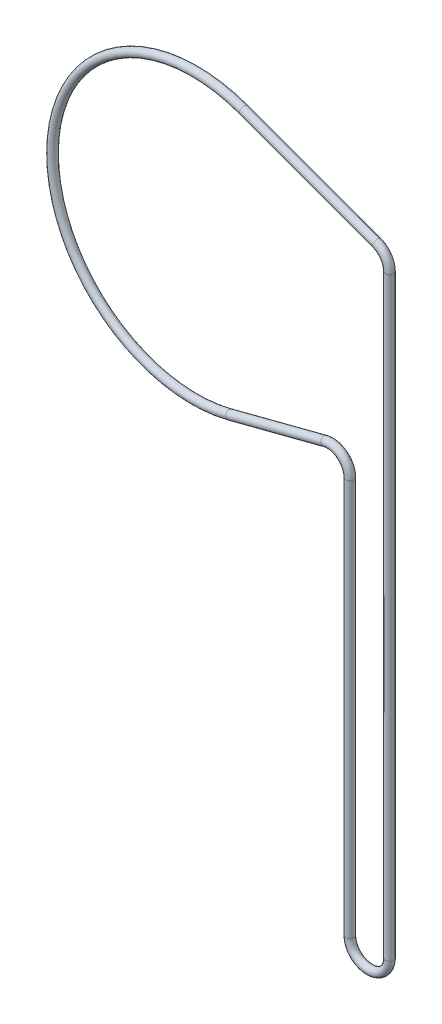
ISO-10303-21;
HEADER;
FILE_DESCRIPTION(('STEP AP214'),'2;1');
FILE_NAME('part.step','',(''),(''),'','','');
FILE_SCHEMA(('AUTOMOTIVE_DESIGN { 1 0 10303 214 1 1 1 1 }'));
ENDSEC;
DATA;
#1=APPLICATION_CONTEXT('core data for automotive mechanical design processes');
#2=APPLICATION_PROTOCOL_DEFINITION('international standard','automotive_design',2000,#1);
#3=PRODUCT_CONTEXT('',#1,'mechanical');
#4=PRODUCT('Part','Part','',(#3));
#5=PRODUCT_RELATED_PRODUCT_CATEGORY('part','',(#4));
#6=PRODUCT_DEFINITION_FORMATION('','',#4);
#7=PRODUCT_DEFINITION_CONTEXT('part definition',#1,'design');
#8=PRODUCT_DEFINITION('design','',#6,#7);
#9=PRODUCT_DEFINITION_SHAPE('','',#8);
#10=(LENGTH_UNIT() NAMED_UNIT(*) SI_UNIT(.MILLI.,.METRE.));
#11=(NAMED_UNIT(*) PLANE_ANGLE_UNIT() SI_UNIT($,.RADIAN.));
#12=(NAMED_UNIT(*) SI_UNIT($,.STERADIAN.) SOLID_ANGLE_UNIT());
#13=UNCERTAINTY_MEASURE_WITH_UNIT(LENGTH_MEASURE(1.E-05),#10,'distance_accuracy_value','');
#14=(GEOMETRIC_REPRESENTATION_CONTEXT(3) GLOBAL_UNCERTAINTY_ASSIGNED_CONTEXT((#13)) GLOBAL_UNIT_ASSIGNED_CONTEXT((#10,
#11,#12)) REPRESENTATION_CONTEXT('',''));
#15=CARTESIAN_POINT('',(0.,0.,0.));
#16=DIRECTION('',(0.,0.,1.));
#17=DIRECTION('',(1.,0.,0.));
#18=AXIS2_PLACEMENT_3D('',#15,#16,#17);
#19=CARTESIAN_POINT('',(-6.,0.,0.));
#20=DIRECTION('',(0.,0.,1.));
#21=DIRECTION('',(1.,0.,0.));
#22=AXIS2_PLACEMENT_3D('',#19,#20,#21);
#23=TOROIDAL_SURFACE('',#22,5.99999999999997,1.25);
#24=CARTESIAN_POINT('',(-12.,-6.38378239159465E-13,0.));
#25=DIRECTION('',(0.,-1.,0.));
#26=DIRECTION('',(0.,0.,1.));
#27=AXIS2_PLACEMENT_3D('',#24,#25,#26);
#28=CIRCLE('',#27,1.25);
#29=CARTESIAN_POINT('',(-10.75,-6.10622663543836E-13,0.));
#30=VERTEX_POINT('',#29);
#31=EDGE_CURVE('E41',#30,#30,#28,.T.);
#32=ORIENTED_EDGE('',*,*,#31,.T.);
#33=EDGE_LOOP('',(#32));
#34=FACE_BOUND('',#33,.T.);
#35=CARTESIAN_POINT('',(0.,1.11022302462516E-13,0.));
#36=DIRECTION('',(0.,1.,0.));
#37=DIRECTION('',(0.,0.,1.));
#38=AXIS2_PLACEMENT_3D('',#35,#36,#37);
#39=CIRCLE('',#38,1.25);
#40=CARTESIAN_POINT('',(0.,0.,1.25));
#41=VERTEX_POINT('',#40);
#42=EDGE_CURVE('E10',#41,#41,#39,.T.);
#43=ORIENTED_EDGE('',*,*,#42,.F.);
#44=EDGE_LOOP('',(#43));
#45=FACE_BOUND('',#44,.T.);
#46=ADVANCED_FACE('F31',(#34,#45),#23,.T.);
#47=CARTESIAN_POINT('',(-12.,119.999999999999,0.));
#48=DIRECTION('',(0.,-1.,0.));
#49=DIRECTION('',(1.,0.,0.));
#50=AXIS2_PLACEMENT_3D('',#47,#48,#49);
#51=CYLINDRICAL_SURFACE('',#50,1.25);
#52=CARTESIAN_POINT('',(-12.,119.999999999999,0.));
#53=DIRECTION('',(0.,-1.,0.));
#54=DIRECTION('',(0.,0.,1.));
#55=AXIS2_PLACEMENT_3D('',#52,#53,#54);
#56=CIRCLE('',#55,1.25);
#57=CARTESIAN_POINT('',(-10.75,119.999999999999,0.));
#58=VERTEX_POINT('',#57);
#59=EDGE_CURVE('E45',#58,#58,#56,.T.);
#60=CARTESIAN_POINT('',(-10.75,119.999999999999,0.));
#61=CARTESIAN_POINT('',(-10.75,118.749999999999,0.));
#62=CARTESIAN_POINT('',(-10.75,117.499999999999,0.));
#63=CARTESIAN_POINT('',(-10.75,114.999999999999,0.));
#64=CARTESIAN_POINT('',(-10.75,113.749999999999,0.));
#65=CARTESIAN_POINT('',(-10.75,111.249999999999,0.));
#66=CARTESIAN_POINT('',(-10.75,109.999999999999,0.));
#67=CARTESIAN_POINT('',(-10.75,107.499999999999,0.));
#68=CARTESIAN_POINT('',(-10.75,106.249999999999,0.));
#69=CARTESIAN_POINT('',(-10.75,103.749999999999,0.));
#70=CARTESIAN_POINT('',(-10.75,102.499999999999,0.));
#71=CARTESIAN_POINT('',(-10.75,99.9999999999994,0.));
#72=CARTESIAN_POINT('',(-10.75,98.7499999999994,0.));
#73=CARTESIAN_POINT('',(-10.75,96.2499999999994,0.));
#74=CARTESIAN_POINT('',(-10.75,94.9999999999994,0.));
#75=CARTESIAN_POINT('',(-10.75,92.4999999999994,0.));
#76=CARTESIAN_POINT('',(-10.75,91.2499999999994,0.));
#77=CARTESIAN_POINT('',(-10.75,88.7499999999994,0.));
#78=CARTESIAN_POINT('',(-10.75,87.4999999999994,0.));
#79=CARTESIAN_POINT('',(-10.75,84.9999999999994,0.));
#80=CARTESIAN_POINT('',(-10.75,83.7499999999994,0.));
#81=CARTESIAN_POINT('',(-10.75,81.2499999999994,0.));
#82=CARTESIAN_POINT('',(-10.75,79.9999999999994,0.));
#83=CARTESIAN_POINT('',(-10.75,77.4999999999994,0.));
#84=CARTESIAN_POINT('',(-10.75,76.2499999999994,0.));
#85=CARTESIAN_POINT('',(-10.75,73.7499999999994,0.));
#86=CARTESIAN_POINT('',(-10.75,72.4999999999994,0.));
#87=CARTESIAN_POINT('',(-10.75,69.9999999999994,0.));
#88=CARTESIAN_POINT('',(-10.75,68.7499999999994,0.));
#89=CARTESIAN_POINT('',(-10.75,66.2499999999994,0.));
#90=CARTESIAN_POINT('',(-10.75,64.9999999999994,0.));
#91=CARTESIAN_POINT('',(-10.75,62.4999999999994,0.));
#92=CARTESIAN_POINT('',(-10.75,61.2499999999994,0.));
#93=CARTESIAN_POINT('',(-10.75,58.7499999999994,0.));
#94=CARTESIAN_POINT('',(-10.75,57.4999999999994,0.));
#95=CARTESIAN_POINT('',(-10.75,54.9999999999994,0.));
#96=CARTESIAN_POINT('',(-10.75,53.7499999999994,0.));
#97=CARTESIAN_POINT('',(-10.75,51.2499999999994,0.));
#98=CARTESIAN_POINT('',(-10.75,49.9999999999994,0.));
#99=CARTESIAN_POINT('',(-10.75,47.4999999999994,0.));
#100=CARTESIAN_POINT('',(-10.75,46.2499999999994,0.));
#101=CARTESIAN_POINT('',(-10.75,43.7499999999994,0.));
#102=CARTESIAN_POINT('',(-10.75,42.4999999999994,0.));
#103=CARTESIAN_POINT('',(-10.75,39.9999999999994,0.));
#104=CARTESIAN_POINT('',(-10.75,38.7499999999994,0.));
#105=CARTESIAN_POINT('',(-10.75,36.2499999999994,0.));
#106=CARTESIAN_POINT('',(-10.75,34.9999999999994,0.));
#107=CARTESIAN_POINT('',(-10.75,32.4999999999994,0.));
#108=CARTESIAN_POINT('',(-10.75,31.2499999999994,0.));
#109=CARTESIAN_POINT('',(-10.75,28.7499999999994,0.));
#110=CARTESIAN_POINT('',(-10.75,27.4999999999994,0.));
#111=CARTESIAN_POINT('',(-10.75,24.9999999999994,0.));
#112=CARTESIAN_POINT('',(-10.75,23.7499999999994,0.));
#113=CARTESIAN_POINT('',(-10.75,21.2499999999994,0.));
#114=CARTESIAN_POINT('',(-10.75,19.9999999999994,0.));
#115=CARTESIAN_POINT('',(-10.75,17.4999999999994,0.));
#116=CARTESIAN_POINT('',(-10.75,16.2499999999994,0.));
#117=CARTESIAN_POINT('',(-10.75,13.7499999999994,0.));
#118=CARTESIAN_POINT('',(-10.75,12.4999999999994,0.));
#119=CARTESIAN_POINT('',(-10.75,9.99999999999938,0.));
#120=CARTESIAN_POINT('',(-10.75,8.74999999999938,0.));
#121=CARTESIAN_POINT('',(-10.75,6.24999999999939,0.));
#122=CARTESIAN_POINT('',(-10.75,4.99999999999939,0.));
#123=CARTESIAN_POINT('',(-10.75,2.49999999999939,0.));
#124=CARTESIAN_POINT('',(-10.75,1.24999999999939,0.));
#125=CARTESIAN_POINT('',(-10.75,-6.10622663543836E-13,0.));
#126=B_SPLINE_CURVE_WITH_KNOTS('',3,(#60,#61,#62,#63,#64,#65,#66,#67,#68,#69,#70,#71,#72,#73,
#74,#75,#76,#77,#78,#79,#80,#81,#82,#83,#84,#85,#86,#87,#88,#89,#90,#91,#92,#93,#94,#95,#96,#97,
#98,#99,#100,#101,#102,#103,#104,#105,#106,#107,#108,#109,#110,#111,#112,#113,#114,#115,#116,
#117,#118,#119,#120,#121,#122,#123,#124,#125),.UNSPECIFIED.,.F.,.F.,(4,2,2,2,2,2,2,2,2,2,2,2,2,
2,2,2,2,2,2,2,2,2,2,2,2,2,2,2,2,2,2,2,4),(0.,3.74999999999999,7.49999999999999,11.25,15.,18.75,
22.5,26.25,30.,33.75,37.5,41.25,45.,48.75,52.5,56.25,60.,63.75,67.5,71.25,75.,78.75,82.5,86.25,
90.,93.75,97.5,101.25,105.,108.75,112.5,116.25,120.),.UNSPECIFIED.);
#127=EDGE_CURVE('BSEAM64',#58,#30,#126,.T.);
#128=ORIENTED_EDGE('',*,*,#59,.T.);
#129=ORIENTED_EDGE('',*,*,#31,.F.);
#130=ORIENTED_EDGE('',*,*,#127,.T.);
#131=ORIENTED_EDGE('',*,*,#127,.F.);
#132=EDGE_LOOP('',(#128,#130,#129,#131));
#133=FACE_BOUND('',#132,.T.);
#134=ADVANCED_FACE('F64',(#133),#51,.T.);
#135=CARTESIAN_POINT('',(-18.,120.,0.));
#136=DIRECTION('',(0.,0.,-1.));
#137=DIRECTION('',(-1.,0.,0.));
#138=AXIS2_PLACEMENT_3D('',#135,#136,#137);
#139=TOROIDAL_SURFACE('',#138,6.00000000000001,1.25);
#140=CARTESIAN_POINT('',(-19.5039468004835,125.808454529504,0.));
#141=DIRECTION('',(0.968075754917304,0.250657800080689,0.));
#142=DIRECTION('',(0.,0.,1.));
#143=AXIS2_PLACEMENT_3D('',#140,#141,#142);
#144=CIRCLE('',#143,1.25);
#145=CARTESIAN_POINT('',(-19.8172690505842,127.018549223151,0.));
#146=VERTEX_POINT('',#145);
#147=EDGE_CURVE('E50',#146,#146,#144,.T.);
#148=CARTESIAN_POINT('',(-18.,120.,0.));
#149=DIRECTION('',(0.,0.,-1.));
#150=DIRECTION('',(-1.,0.,0.));
#151=AXIS2_PLACEMENT_3D('',#148,#149,#150);
#152=CIRCLE('',#151,7.25000000000001);
#153=EDGE_CURVE('',#146,#58,#152,.T.);
#154=ORIENTED_EDGE('',*,*,#147,.T.);
#155=ORIENTED_EDGE('',*,*,#59,.F.);
#156=ORIENTED_EDGE('',*,*,#153,.T.);
#157=ORIENTED_EDGE('',*,*,#153,.F.);
#158=EDGE_LOOP('',(#154,#156,#155,#157));
#159=FACE_BOUND('',#158,.T.);
#160=ADVANCED_FACE('F68',(#159),#139,.T.);
#161=CARTESIAN_POINT('',(-48.2217145965304,118.372742538556,0.));
#162=DIRECTION('',(0.968075754917308,0.250657800080675,0.));
#163=DIRECTION('',(-0.250657800080675,0.968075754917308,0.));
#164=AXIS2_PLACEMENT_3D('',#161,#162,#163);
#165=CYLINDRICAL_SURFACE('',#164,1.25);
#166=CARTESIAN_POINT('',(-48.2217145965304,118.372742538556,0.));
#167=DIRECTION('',(0.968075754917304,0.250657800080689,0.));
#168=DIRECTION('',(0.,0.,1.));
#169=AXIS2_PLACEMENT_3D('',#166,#167,#168);
#170=CIRCLE('',#169,1.25);
#171=CARTESIAN_POINT('',(-47.9083923464295,117.162647844909,0.));
#172=VERTEX_POINT('',#171);
#173=EDGE_CURVE('E109',#172,#172,#170,.T.);
#174=ORIENTED_EDGE('',*,*,#173,.T.);
#175=EDGE_LOOP('',(#174));
#176=FACE_BOUND('',#175,.T.);
#177=ORIENTED_EDGE('',*,*,#147,.F.);
#178=EDGE_LOOP('',(#177));
#179=FACE_BOUND('',#178,.T.);
#180=ADVANCED_FACE('F73',(#176,#179),#165,.T.);
#181=CARTESIAN_POINT('',(-59.,160.,0.));
#182=DIRECTION('',(0.,0.,1.));
#183=DIRECTION('',(1.,0.,0.));
#184=AXIS2_PLACEMENT_3D('',#181,#182,#183);
#185=TOROIDAL_SURFACE('',#184,43.,1.25);
#186=CARTESIAN_POINT('',(-44.2187255263281,200.379622644769,0.));
#187=DIRECTION('',(-0.939060991738824,0.34375056915516,0.));
#188=DIRECTION('',(0.,0.,1.));
#189=AXIS2_PLACEMENT_3D('',#186,#187,#188);
#190=CIRCLE('',#189,1.25);
#191=CARTESIAN_POINT('',(-43.7890373148841,201.553448884443,0.));
#192=VERTEX_POINT('',#191);
#193=EDGE_CURVE('E104',#192,#192,#190,.T.);
#194=CARTESIAN_POINT('',(-59.,160.,0.));
#195=DIRECTION('',(0.,0.,1.));
#196=DIRECTION('',(1.,0.,0.));
#197=AXIS2_PLACEMENT_3D('',#194,#195,#196);
#198=CIRCLE('',#197,44.25);
#199=EDGE_CURVE('',#192,#172,#198,.T.);
#200=ORIENTED_EDGE('',*,*,#193,.T.);
#201=ORIENTED_EDGE('',*,*,#173,.F.);
#202=ORIENTED_EDGE('',*,*,#199,.T.);
#203=ORIENTED_EDGE('',*,*,#199,.F.);
#204=EDGE_LOOP('',(#200,#202,#201,#203));
#205=FACE_BOUND('',#204,.T.);
#206=ADVANCED_FACE('F80',(#205),#185,.T.);
#207=CARTESIAN_POINT('',(-3.93749658506903,185.634365950433,0.));
#208=DIRECTION('',(-0.939060991738823,0.343750569155161,0.));
#209=DIRECTION('',(-0.343750569155161,-0.939060991738824,0.));
#210=AXIS2_PLACEMENT_3D('',#207,#208,#209);
#211=CYLINDRICAL_SURFACE('',#210,1.25);
#212=CARTESIAN_POINT('',(-3.93749658506903,185.634365950433,0.));
#213=DIRECTION('',(-0.939060991738824,0.34375056915516,0.));
#214=DIRECTION('',(0.,0.,1.));
#215=AXIS2_PLACEMENT_3D('',#212,#213,#214);
#216=CIRCLE('',#215,1.25);
#217=CARTESIAN_POINT('',(-3.50780837362509,186.808192190106,0.));
#218=VERTEX_POINT('',#217);
#219=EDGE_CURVE('E101',#218,#218,#216,.T.);
#220=ORIENTED_EDGE('',*,*,#219,.T.);
#221=EDGE_LOOP('',(#220));
#222=FACE_BOUND('',#221,.T.);
#223=ORIENTED_EDGE('',*,*,#193,.F.);
#224=EDGE_LOOP('',(#223));
#225=FACE_BOUND('',#224,.T.);
#226=ADVANCED_FACE('F84',(#222,#225),#211,.T.);
#227=CARTESIAN_POINT('',(-6.,180.,0.));
#228=DIRECTION('',(0.,0.,1.));
#229=DIRECTION('',(1.,0.,0.));
#230=AXIS2_PLACEMENT_3D('',#227,#228,#229);
#231=TOROIDAL_SURFACE('',#230,6.,1.25);
#232=CARTESIAN_POINT('',(0.,180.,0.));
#233=DIRECTION('',(0.,1.,0.));
#234=DIRECTION('',(0.,0.,1.));
#235=AXIS2_PLACEMENT_3D('',#232,#233,#234);
#236=CIRCLE('',#235,1.25);
#237=CARTESIAN_POINT('',(1.25,180.,0.));
#238=VERTEX_POINT('',#237);
#239=EDGE_CURVE('E100',#238,#238,#236,.T.);
#240=CARTESIAN_POINT('',(-6.,180.,0.));
#241=DIRECTION('',(0.,0.,1.));
#242=DIRECTION('',(1.,0.,0.));
#243=AXIS2_PLACEMENT_3D('',#240,#241,#242);
#244=CIRCLE('',#243,7.25);
#245=EDGE_CURVE('',#238,#218,#244,.T.);
#246=ORIENTED_EDGE('',*,*,#239,.T.);
#247=ORIENTED_EDGE('',*,*,#219,.F.);
#248=ORIENTED_EDGE('',*,*,#245,.T.);
#249=ORIENTED_EDGE('',*,*,#245,.F.);
#250=EDGE_LOOP('',(#246,#248,#247,#249));
#251=FACE_BOUND('',#250,.T.);
#252=ADVANCED_FACE('F88',(#251),#231,.T.);
#253=CARTESIAN_POINT('',(0.,180.,0.));
#254=DIRECTION('',(0.,-1.,0.));
#255=DIRECTION('',(0.,0.,-1.));
#256=AXIS2_PLACEMENT_3D('',#253,#254,#255);
#257=CYLINDRICAL_SURFACE('',#256,1.25);
#258=ORIENTED_EDGE('',*,*,#239,.F.);
#259=EDGE_LOOP('',(#258));
#260=FACE_BOUND('',#259,.T.);
#261=ORIENTED_EDGE('',*,*,#42,.T.);
#262=EDGE_LOOP('',(#261));
#263=FACE_BOUND('',#262,.T.);
#264=ADVANCED_FACE('F91',(#260,#263),#257,.T.);
#265=CLOSED_SHELL('',(#46,#134,#160,#180,#206,#226,#252,#264));
#266=MANIFOLD_SOLID_BREP('B2',#265);
#267=ADVANCED_BREP_SHAPE_REPRESENTATION('',(#18,#266),#14);
#268=SHAPE_DEFINITION_REPRESENTATION(#9,#267);
ENDSEC;
END-ISO-10303-21;
